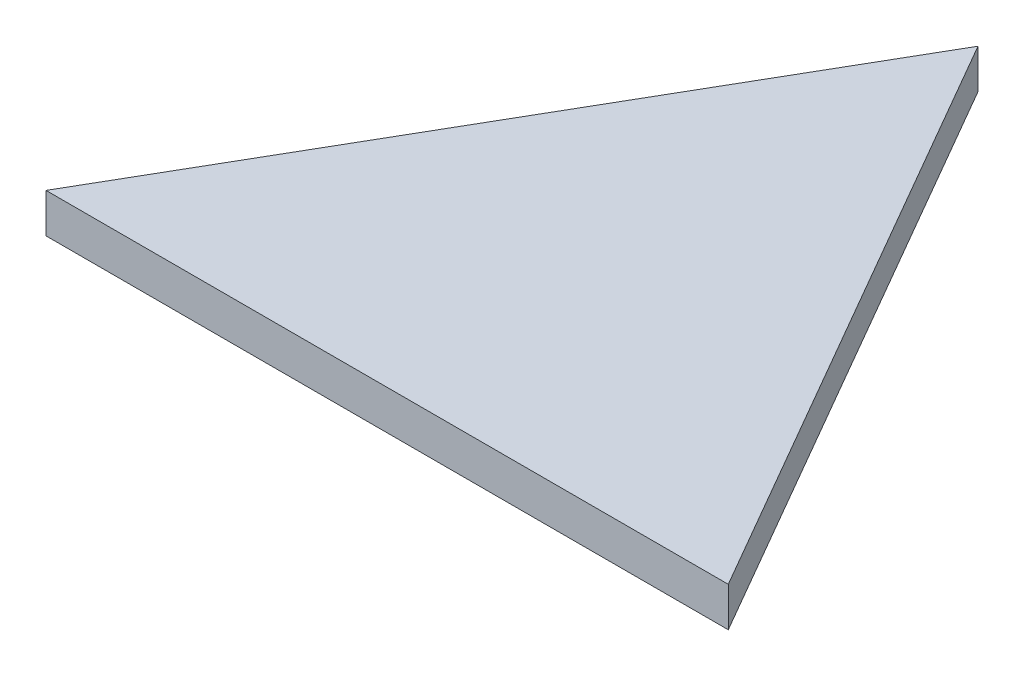
ISO-10303-21;
HEADER;
FILE_DESCRIPTION(('STEP AP214'),'2;1');
FILE_NAME('part.step','',(''),(''),'','','');
FILE_SCHEMA(('AUTOMOTIVE_DESIGN { 1 0 10303 214 1 1 1 1 }'));
ENDSEC;
DATA;
#1=APPLICATION_CONTEXT('core data for automotive mechanical design processes');
#2=APPLICATION_PROTOCOL_DEFINITION('international standard','automotive_design',2000,#1);
#3=PRODUCT_CONTEXT('',#1,'mechanical');
#4=PRODUCT('Part','Part','',(#3));
#5=PRODUCT_RELATED_PRODUCT_CATEGORY('part','',(#4));
#6=PRODUCT_DEFINITION_FORMATION('','',#4);
#7=PRODUCT_DEFINITION_CONTEXT('part definition',#1,'design');
#8=PRODUCT_DEFINITION('design','',#6,#7);
#9=PRODUCT_DEFINITION_SHAPE('','',#8);
#10=(LENGTH_UNIT() NAMED_UNIT(*) SI_UNIT(.MILLI.,.METRE.));
#11=(NAMED_UNIT(*) PLANE_ANGLE_UNIT() SI_UNIT($,.RADIAN.));
#12=(NAMED_UNIT(*) SI_UNIT($,.STERADIAN.) SOLID_ANGLE_UNIT());
#13=UNCERTAINTY_MEASURE_WITH_UNIT(LENGTH_MEASURE(1.E-05),#10,'distance_accuracy_value','');
#14=(GEOMETRIC_REPRESENTATION_CONTEXT(3) GLOBAL_UNCERTAINTY_ASSIGNED_CONTEXT((#13)) GLOBAL_UNIT_ASSIGNED_CONTEXT((#10,
#11,#12)) REPRESENTATION_CONTEXT('',''));
#15=CARTESIAN_POINT('',(0.,0.,0.));
#16=DIRECTION('',(0.,0.,1.));
#17=DIRECTION('',(1.,0.,0.));
#18=AXIS2_PLACEMENT_3D('',#15,#16,#17);
#19=CARTESIAN_POINT('',(86.6025403784447,10.,49.9999999999994));
#20=DIRECTION('',(-0.866025403784436,0.,0.500000000000004));
#21=DIRECTION('',(0.500000000000004,0.,0.866025403784436));
#22=AXIS2_PLACEMENT_3D('',#19,#20,#21);
#23=PLANE('',#22);
#24=DIRECTION('',(-0.500000000000004,0.,-0.866025403784436));
#25=VECTOR('',#24,1.);
#26=CARTESIAN_POINT('',(86.6025403784447,0.,49.9999999999994));
#27=LINE('',#26,#25);
#28=CARTESIAN_POINT('',(86.6025403784447,0.,49.9999999999994));
#29=VERTEX_POINT('',#28);
#30=CARTESIAN_POINT('',(0.,0.,-100.));
#31=VERTEX_POINT('',#30);
#32=EDGE_CURVE('E82',#29,#31,#27,.T.);
#33=ORIENTED_EDGE('',*,*,#32,.T.);
#34=DIRECTION('',(0.,-1.,0.));
#35=VECTOR('',#34,1.);
#36=CARTESIAN_POINT('',(0.,10.,-100.));
#37=LINE('',#36,#35);
#38=CARTESIAN_POINT('',(0.,10.,-100.));
#39=VERTEX_POINT('',#38);
#40=EDGE_CURVE('E11',#39,#31,#37,.T.);
#41=ORIENTED_EDGE('',*,*,#40,.F.);
#42=DIRECTION('',(-0.500000000000004,0.,-0.866025403784436));
#43=VECTOR('',#42,1.);
#44=CARTESIAN_POINT('',(86.6025403784447,10.,49.9999999999994));
#45=LINE('',#44,#43);
#46=CARTESIAN_POINT('',(86.6025403784447,10.,49.9999999999994));
#47=VERTEX_POINT('',#46);
#48=EDGE_CURVE('E75',#47,#39,#45,.T.);
#49=ORIENTED_EDGE('',*,*,#48,.F.);
#50=DIRECTION('',(0.,-1.,0.));
#51=VECTOR('',#50,1.);
#52=CARTESIAN_POINT('',(86.6025403784447,10.,49.9999999999994));
#53=LINE('',#52,#51);
#54=EDGE_CURVE('E83',#47,#29,#53,.T.);
#55=ORIENTED_EDGE('',*,*,#54,.T.);
#56=EDGE_LOOP('',(#33,#41,#49,#55));
#57=FACE_BOUND('',#56,.T.);
#58=ADVANCED_FACE('F35',(#57),#23,.F.);
#59=CARTESIAN_POINT('',(0.,10.,-100.));
#60=DIRECTION('',(0.86602540378444,0.,0.499999999999998));
#61=DIRECTION('',(0.499999999999998,0.,-0.86602540378444));
#62=AXIS2_PLACEMENT_3D('',#59,#60,#61);
#63=PLANE('',#62);
#64=DIRECTION('',(-0.499999999999998,0.,0.86602540378444));
#65=VECTOR('',#64,1.);
#66=CARTESIAN_POINT('',(0.,0.,-100.));
#67=LINE('',#66,#65);
#68=CARTESIAN_POINT('',(-86.602540378444,0.,50.0000000000006));
#69=VERTEX_POINT('',#68);
#70=EDGE_CURVE('E63',#31,#69,#67,.T.);
#71=ORIENTED_EDGE('',*,*,#70,.T.);
#72=DIRECTION('',(0.,-1.,0.));
#73=VECTOR('',#72,1.);
#74=CARTESIAN_POINT('',(-86.602540378444,10.,50.0000000000006));
#75=LINE('',#74,#73);
#76=CARTESIAN_POINT('',(-86.602540378444,10.,50.0000000000006));
#77=VERTEX_POINT('',#76);
#78=EDGE_CURVE('E43',#77,#69,#75,.T.);
#79=ORIENTED_EDGE('',*,*,#78,.F.);
#80=DIRECTION('',(-0.499999999999998,0.,0.86602540378444));
#81=VECTOR('',#80,1.);
#82=CARTESIAN_POINT('',(0.,10.,-100.));
#83=LINE('',#82,#81);
#84=EDGE_CURVE('E71',#39,#77,#83,.T.);
#85=ORIENTED_EDGE('',*,*,#84,.F.);
#86=ORIENTED_EDGE('',*,*,#40,.T.);
#87=EDGE_LOOP('',(#71,#79,#85,#86));
#88=FACE_BOUND('',#87,.T.);
#89=ADVANCED_FACE('F72',(#88),#63,.F.);
#90=CARTESIAN_POINT('',(-86.602540378444,10.,50.0000000000006));
#91=DIRECTION('',(0.,0.,-1.));
#92=DIRECTION('',(-1.,0.,0.));
#93=AXIS2_PLACEMENT_3D('',#90,#91,#92);
#94=PLANE('',#93);
#95=DIRECTION('',(1.,0.,0.));
#96=VECTOR('',#95,1.);
#97=CARTESIAN_POINT('',(-86.602540378444,0.,50.0000000000006));
#98=LINE('',#97,#96);
#99=EDGE_CURVE('E68',#69,#29,#98,.T.);
#100=ORIENTED_EDGE('',*,*,#99,.T.);
#101=ORIENTED_EDGE('',*,*,#54,.F.);
#102=DIRECTION('',(1.,0.,0.));
#103=VECTOR('',#102,1.);
#104=CARTESIAN_POINT('',(-86.602540378444,10.,50.0000000000006));
#105=LINE('',#104,#103);
#106=EDGE_CURVE('E51',#77,#47,#105,.T.);
#107=ORIENTED_EDGE('',*,*,#106,.F.);
#108=ORIENTED_EDGE('',*,*,#78,.T.);
#109=EDGE_LOOP('',(#100,#101,#107,#108));
#110=FACE_BOUND('',#109,.T.);
#111=ADVANCED_FACE('F90',(#110),#94,.F.);
#112=CARTESIAN_POINT('',(0.,10.,0.));
#113=DIRECTION('',(0.,1.,0.));
#114=DIRECTION('',(0.,0.,1.));
#115=AXIS2_PLACEMENT_3D('',#112,#113,#114);
#116=PLANE('',#115);
#117=ORIENTED_EDGE('',*,*,#48,.T.);
#118=ORIENTED_EDGE('',*,*,#84,.T.);
#119=ORIENTED_EDGE('',*,*,#106,.T.);
#120=EDGE_LOOP('',(#117,#118,#119));
#121=FACE_BOUND('',#120,.T.);
#122=ADVANCED_FACE('F78',(#121),#116,.T.);
#123=CARTESIAN_POINT('',(0.,0.,0.));
#124=DIRECTION('',(0.,1.,0.));
#125=DIRECTION('',(0.,0.,1.));
#126=AXIS2_PLACEMENT_3D('',#123,#124,#125);
#127=PLANE('',#126);
#128=ORIENTED_EDGE('',*,*,#32,.F.);
#129=ORIENTED_EDGE('',*,*,#99,.F.);
#130=ORIENTED_EDGE('',*,*,#70,.F.);
#131=EDGE_LOOP('',(#128,#129,#130));
#132=FACE_BOUND('',#131,.T.);
#133=ADVANCED_FACE('F91',(#132),#127,.F.);
#134=CLOSED_SHELL('',(#58,#89,#111,#122,#133));
#135=MANIFOLD_SOLID_BREP('B2',#134);
#136=ADVANCED_BREP_SHAPE_REPRESENTATION('',(#18,#135),#14);
#137=SHAPE_DEFINITION_REPRESENTATION(#9,#136);
ENDSEC;
END-ISO-10303-21;
